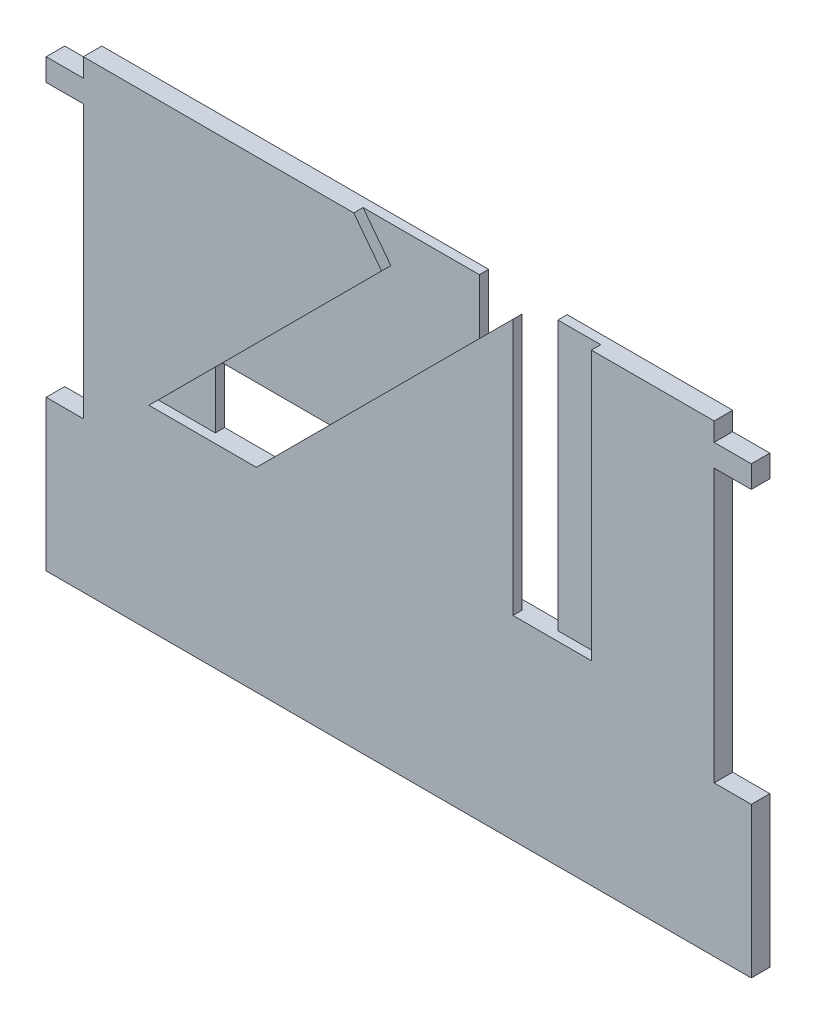
ISO-10303-21;
HEADER;
FILE_DESCRIPTION(('STEP AP214'),'2;1');
FILE_NAME('part.step','',(''),(''),'','','');
FILE_SCHEMA(('AUTOMOTIVE_DESIGN { 1 0 10303 214 1 1 1 1 }'));
ENDSEC;
DATA;
#1=APPLICATION_CONTEXT('core data for automotive mechanical design processes');
#2=APPLICATION_PROTOCOL_DEFINITION('international standard','automotive_design',2000,#1);
#3=PRODUCT_CONTEXT('',#1,'mechanical');
#4=PRODUCT('Part','Part','',(#3));
#5=PRODUCT_RELATED_PRODUCT_CATEGORY('part','',(#4));
#6=PRODUCT_DEFINITION_FORMATION('','',#4);
#7=PRODUCT_DEFINITION_CONTEXT('part definition',#1,'design');
#8=PRODUCT_DEFINITION('design','',#6,#7);
#9=PRODUCT_DEFINITION_SHAPE('','',#8);
#10=(LENGTH_UNIT() NAMED_UNIT(*) SI_UNIT(.MILLI.,.METRE.));
#11=(NAMED_UNIT(*) PLANE_ANGLE_UNIT() SI_UNIT($,.RADIAN.));
#12=(NAMED_UNIT(*) SI_UNIT($,.STERADIAN.) SOLID_ANGLE_UNIT());
#13=UNCERTAINTY_MEASURE_WITH_UNIT(LENGTH_MEASURE(1.E-05),#10,'distance_accuracy_value','');
#14=(GEOMETRIC_REPRESENTATION_CONTEXT(3) GLOBAL_UNCERTAINTY_ASSIGNED_CONTEXT((#13)) GLOBAL_UNIT_ASSIGNED_CONTEXT((#10,
#11,#12)) REPRESENTATION_CONTEXT('',''));
#15=CARTESIAN_POINT('',(0.,0.,0.));
#16=DIRECTION('',(0.,0.,1.));
#17=DIRECTION('',(1.,0.,0.));
#18=AXIS2_PLACEMENT_3D('',#15,#16,#17);
#19=CARTESIAN_POINT('',(-17.,-0.5,1.));
#20=DIRECTION('',(0.,-1.,0.));
#21=DIRECTION('',(0.,0.,-1.));
#22=AXIS2_PLACEMENT_3D('',#19,#20,#21);
#23=PLANE('',#22);
#24=DIRECTION('',(0.,0.,1.));
#25=VECTOR('',#24,1.);
#26=CARTESIAN_POINT('',(-2.42175340145162,-0.5,1.));
#27=LINE('',#26,#25);
#28=CARTESIAN_POINT('',(-2.42175340145161,-0.5,0.5));
#29=VERTEX_POINT('',#28);
#30=CARTESIAN_POINT('',(-2.42175340145161,-0.5,1.));
#31=VERTEX_POINT('',#30);
#32=EDGE_CURVE('E11',#29,#31,#27,.T.);
#33=ORIENTED_EDGE('',*,*,#32,.F.);
#34=DIRECTION('',(1.,0.,0.));
#35=VECTOR('',#34,1.);
#36=CARTESIAN_POINT('',(-17.,-0.5,0.5));
#37=LINE('',#36,#35);
#38=CARTESIAN_POINT('',(3.84615384615386,-0.5,0.5));
#39=VERTEX_POINT('',#38);
#40=EDGE_CURVE('E318',#29,#39,#37,.T.);
#41=ORIENTED_EDGE('',*,*,#40,.T.);
#42=DIRECTION('',(0.,0.,1.));
#43=VECTOR('',#42,1.);
#44=CARTESIAN_POINT('',(3.84615384615386,-0.5,1.));
#45=LINE('',#44,#43);
#46=CARTESIAN_POINT('',(3.84615384615386,-0.5,0.));
#47=VERTEX_POINT('',#46);
#48=EDGE_CURVE('E443',#47,#39,#45,.T.);
#49=ORIENTED_EDGE('',*,*,#48,.F.);
#50=DIRECTION('',(1.,0.,0.));
#51=VECTOR('',#50,1.);
#52=CARTESIAN_POINT('',(-17.,-0.5,0.));
#53=LINE('',#52,#51);
#54=CARTESIAN_POINT('',(-17.,-0.5,0.));
#55=VERTEX_POINT('',#54);
#56=EDGE_CURVE('E449',#47,#55,#53,.F.);
#57=ORIENTED_EDGE('',*,*,#56,.T.);
#58=DIRECTION('',(0.,0.,-1.));
#59=VECTOR('',#58,1.);
#60=CARTESIAN_POINT('',(-17.,-0.5,1.));
#61=LINE('',#60,#59);
#62=CARTESIAN_POINT('',(-17.,-0.5,1.));
#63=VERTEX_POINT('',#62);
#64=EDGE_CURVE('E352',#63,#55,#61,.T.);
#65=ORIENTED_EDGE('',*,*,#64,.F.);
#66=DIRECTION('',(-1.,0.,0.));
#67=VECTOR('',#66,1.);
#68=CARTESIAN_POINT('',(-17.,-0.5,1.));
#69=LINE('',#68,#67);
#70=EDGE_CURVE('E389',#31,#63,#69,.T.);
#71=ORIENTED_EDGE('',*,*,#70,.F.);
#72=EDGE_LOOP('',(#33,#41,#49,#57,#65,#71));
#73=FACE_BOUND('',#72,.T.);
#74=ADVANCED_FACE('F39',(#73),#23,.F.);
#75=DIRECTION('',(0.,0.,-1.));
#76=VECTOR('',#75,1.);
#77=CARTESIAN_POINT('',(10.3846153846144,-0.5,1.));
#78=LINE('',#77,#76);
#79=CARTESIAN_POINT('',(10.3846153846144,-0.5,1.));
#80=VERTEX_POINT('',#79);
#81=CARTESIAN_POINT('',(10.3846153846144,-0.5,0.5));
#82=VERTEX_POINT('',#81);
#83=EDGE_CURVE('E50',#80,#82,#78,.T.);
#84=ORIENTED_EDGE('',*,*,#83,.F.);
#85=CARTESIAN_POINT('',(17.,-0.5,1.));
#86=VERTEX_POINT('',#85);
#87=EDGE_CURVE('E390',#86,#80,#69,.T.);
#88=ORIENTED_EDGE('',*,*,#87,.F.);
#89=DIRECTION('',(0.,0.,-1.));
#90=VECTOR('',#89,1.);
#91=CARTESIAN_POINT('',(17.,-0.5,1.));
#92=LINE('',#91,#90);
#93=CARTESIAN_POINT('',(17.,-0.5,0.));
#94=VERTEX_POINT('',#93);
#95=EDGE_CURVE('E357',#86,#94,#92,.T.);
#96=ORIENTED_EDGE('',*,*,#95,.T.);
#97=DIRECTION('',(1.,0.,0.));
#98=VECTOR('',#97,1.);
#99=CARTESIAN_POINT('',(-17.,-0.5,0.));
#100=LINE('',#99,#98);
#101=CARTESIAN_POINT('',(8.07692307692309,-0.5,0.));
#102=VERTEX_POINT('',#101);
#103=EDGE_CURVE('E445',#94,#102,#100,.F.);
#104=ORIENTED_EDGE('',*,*,#103,.T.);
#105=DIRECTION('',(0.,0.,-1.));
#106=VECTOR('',#105,1.);
#107=CARTESIAN_POINT('',(8.07692307692309,-0.5,1.));
#108=LINE('',#107,#106);
#109=CARTESIAN_POINT('',(8.07692307692309,-0.5,0.5));
#110=VERTEX_POINT('',#109);
#111=EDGE_CURVE('E294',#110,#102,#108,.T.);
#112=ORIENTED_EDGE('',*,*,#111,.F.);
#113=EDGE_CURVE('E268',#110,#82,#37,.T.);
#114=ORIENTED_EDGE('',*,*,#113,.T.);
#115=EDGE_LOOP('',(#84,#88,#96,#104,#112,#114));
#116=FACE_BOUND('',#115,.T.);
#117=ADVANCED_FACE('F532',(#116),#23,.F.);
#118=CARTESIAN_POINT('',(0.,0.,0.5));
#119=DIRECTION('',(0.,0.,1.));
#120=DIRECTION('',(1.,0.,0.));
#121=AXIS2_PLACEMENT_3D('',#118,#119,#120);
#122=PLANE('',#121);
#123=DIRECTION('',(0.,1.,0.));
#124=VECTOR('',#123,1.);
#125=CARTESIAN_POINT('',(6.15384615384512,-15.,0.5));
#126=LINE('',#125,#124);
#127=CARTESIAN_POINT('',(6.15384615384512,-15.,0.5));
#128=VERTEX_POINT('',#127);
#129=CARTESIAN_POINT('',(6.15384615384512,-1.17788461538462,0.5));
#130=VERTEX_POINT('',#129);
#131=EDGE_CURVE('E272',#128,#130,#126,.T.);
#132=ORIENTED_EDGE('',*,*,#131,.F.);
#133=DIRECTION('',(1.,0.,0.));
#134=VECTOR('',#133,1.);
#135=CARTESIAN_POINT('',(-10.3846153846154,-15.,0.5));
#136=LINE('',#135,#134);
#137=CARTESIAN_POINT('',(-7.66826923077026,-15.,0.5));
#138=VERTEX_POINT('',#137);
#139=EDGE_CURVE('E317',#138,#128,#136,.T.);
#140=ORIENTED_EDGE('',*,*,#139,.F.);
#141=DIRECTION('',(-0.707106781186547,-0.707106781186547,0.));
#142=VECTOR('',#141,1.);
#143=CARTESIAN_POINT('',(6.15384615384512,-1.17788461538462,0.5));
#144=LINE('',#143,#142);
#145=CARTESIAN_POINT('',(-4.2067307692318,-11.5384615384615,0.5));
#146=VERTEX_POINT('',#145);
#147=EDGE_CURVE('E276',#146,#138,#144,.T.);
#148=ORIENTED_EDGE('',*,*,#147,.F.);
#149=DIRECTION('',(-1.,0.,0.));
#150=VECTOR('',#149,1.);
#151=CARTESIAN_POINT('',(3.84615384615386,-11.5384615384615,0.5));
#152=LINE('',#151,#150);
#153=CARTESIAN_POINT('',(3.84615384615386,-11.5384615384615,0.5));
#154=VERTEX_POINT('',#153);
#155=EDGE_CURVE('E326',#154,#146,#152,.T.);
#156=ORIENTED_EDGE('',*,*,#155,.F.);
#157=DIRECTION('',(0.,-1.,0.));
#158=VECTOR('',#157,1.);
#159=CARTESIAN_POINT('',(3.84615384615386,15.,0.5));
#160=LINE('',#159,#158);
#161=CARTESIAN_POINT('',(3.84615384615386,-3.48557692307587,0.5));
#162=VERTEX_POINT('',#161);
#163=EDGE_CURVE('E323',#162,#154,#160,.T.);
#164=ORIENTED_EDGE('',*,*,#163,.F.);
#165=EDGE_CURVE('E278',#130,#162,#144,.T.);
#166=ORIENTED_EDGE('',*,*,#165,.F.);
#167=EDGE_LOOP('',(#132,#140,#148,#156,#164,#166));
#168=FACE_BOUND('',#167,.T.);
#169=ADVANCED_FACE('F601',(#168),#122,.F.);
#170=DIRECTION('',(0.707106781186548,0.707106781186547,0.));
#171=VECTOR('',#170,1.);
#172=CARTESIAN_POINT('',(-13.4615384615395,-15.,0.5));
#173=LINE('',#172,#171);
#174=CARTESIAN_POINT('',(-10.3846153846154,-11.9230769230759,0.5));
#175=VERTEX_POINT('',#174);
#176=CARTESIAN_POINT('',(-10.000000000001,-11.5384615384615,0.5));
#177=VERTEX_POINT('',#176);
#178=EDGE_CURVE('E290',#175,#177,#173,.T.);
#179=ORIENTED_EDGE('',*,*,#178,.F.);
#180=DIRECTION('',(0.,-1.,0.));
#181=VECTOR('',#180,1.);
#182=CARTESIAN_POINT('',(-10.3846153846154,-11.5384615384615,0.5));
#183=LINE('',#182,#181);
#184=CARTESIAN_POINT('',(-10.3846153846154,-11.5384615384615,0.5));
#185=VERTEX_POINT('',#184);
#186=EDGE_CURVE('E331',#185,#175,#183,.T.);
#187=ORIENTED_EDGE('',*,*,#186,.F.);
#188=EDGE_CURVE('E329',#177,#185,#152,.T.);
#189=ORIENTED_EDGE('',*,*,#188,.F.);
#190=EDGE_LOOP('',(#179,#187,#189));
#191=FACE_BOUND('',#190,.T.);
#192=ADVANCED_FACE('F787',(#191),#122,.F.);
#193=CARTESIAN_POINT('',(0.,0.,0.));
#194=DIRECTION('',(0.,0.,-1.));
#195=DIRECTION('',(-1.,0.,0.));
#196=AXIS2_PLACEMENT_3D('',#193,#194,#195);
#197=PLANE('',#196);
#198=ORIENTED_EDGE('',*,*,#56,.F.);
#199=DIRECTION('',(0.,-1.,0.));
#200=VECTOR('',#199,1.);
#201=CARTESIAN_POINT('',(3.84615384615386,15.,0.));
#202=LINE('',#201,#200);
#203=CARTESIAN_POINT('',(3.84615384615386,-11.5384615384615,0.));
#204=VERTEX_POINT('',#203);
#205=EDGE_CURVE('E436',#47,#204,#202,.T.);
#206=ORIENTED_EDGE('',*,*,#205,.T.);
#207=DIRECTION('',(-1.,0.,0.));
#208=VECTOR('',#207,1.);
#209=CARTESIAN_POINT('',(3.84615384615386,-11.5384615384615,0.));
#210=LINE('',#209,#208);
#211=CARTESIAN_POINT('',(-10.3846153846154,-11.5384615384615,0.));
#212=VERTEX_POINT('',#211);
#213=EDGE_CURVE('E344',#204,#212,#210,.T.);
#214=ORIENTED_EDGE('',*,*,#213,.T.);
#215=DIRECTION('',(0.,-1.,0.));
#216=VECTOR('',#215,1.);
#217=CARTESIAN_POINT('',(-10.3846153846154,-11.5384615384615,0.));
#218=LINE('',#217,#216);
#219=CARTESIAN_POINT('',(-10.3846153846154,-15.,0.));
#220=VERTEX_POINT('',#219);
#221=EDGE_CURVE('E325',#212,#220,#218,.T.);
#222=ORIENTED_EDGE('',*,*,#221,.T.);
#223=DIRECTION('',(1.,0.,0.));
#224=VECTOR('',#223,1.);
#225=CARTESIAN_POINT('',(-10.3846153846154,-15.,0.));
#226=LINE('',#225,#224);
#227=CARTESIAN_POINT('',(8.07692307692309,-15.,0.));
#228=VERTEX_POINT('',#227);
#229=EDGE_CURVE('E336',#220,#228,#226,.T.);
#230=ORIENTED_EDGE('',*,*,#229,.T.);
#231=DIRECTION('',(0.,1.,0.));
#232=VECTOR('',#231,1.);
#233=CARTESIAN_POINT('',(8.07692307692309,-15.,0.));
#234=LINE('',#233,#232);
#235=EDGE_CURVE('E342',#228,#102,#234,.T.);
#236=ORIENTED_EDGE('',*,*,#235,.T.);
#237=ORIENTED_EDGE('',*,*,#103,.F.);
#238=DIRECTION('',(0.,1.,0.));
#239=VECTOR('',#238,1.);
#240=CARTESIAN_POINT('',(17.,-0.5,0.));
#241=LINE('',#240,#239);
#242=CARTESIAN_POINT('',(17.,-1.5,0.));
#243=VERTEX_POINT('',#242);
#244=EDGE_CURVE('E393',#243,#94,#241,.T.);
#245=ORIENTED_EDGE('',*,*,#244,.F.);
#246=DIRECTION('',(1.,0.,0.));
#247=VECTOR('',#246,1.);
#248=CARTESIAN_POINT('',(17.,-1.5,0.));
#249=LINE('',#248,#247);
#250=CARTESIAN_POINT('',(19.,-1.5,0.));
#251=VERTEX_POINT('',#250);
#252=EDGE_CURVE('E452',#251,#243,#249,.F.);
#253=ORIENTED_EDGE('',*,*,#252,.F.);
#254=DIRECTION('',(0.,1.,0.));
#255=VECTOR('',#254,1.);
#256=CARTESIAN_POINT('',(19.,-1.5,0.));
#257=LINE('',#256,#255);
#258=CARTESIAN_POINT('',(19.,-2.7,0.));
#259=VERTEX_POINT('',#258);
#260=EDGE_CURVE('E456',#259,#251,#257,.T.);
#261=ORIENTED_EDGE('',*,*,#260,.F.);
#262=DIRECTION('',(1.,0.,0.));
#263=VECTOR('',#262,1.);
#264=CARTESIAN_POINT('',(19.,-2.7,0.));
#265=LINE('',#264,#263);
#266=CARTESIAN_POINT('',(17.,-2.7,0.));
#267=VERTEX_POINT('',#266);
#268=EDGE_CURVE('E457',#267,#259,#265,.T.);
#269=ORIENTED_EDGE('',*,*,#268,.F.);
#270=DIRECTION('',(0.,1.,0.));
#271=VECTOR('',#270,1.);
#272=CARTESIAN_POINT('',(17.,-2.7,0.));
#273=LINE('',#272,#271);
#274=CARTESIAN_POINT('',(17.,-17.3947217067352,0.));
#275=VERTEX_POINT('',#274);
#276=EDGE_CURVE('E459',#275,#267,#273,.T.);
#277=ORIENTED_EDGE('',*,*,#276,.F.);
#278=DIRECTION('',(1.,0.,0.));
#279=VECTOR('',#278,1.);
#280=CARTESIAN_POINT('',(17.,-17.3947217067352,0.));
#281=LINE('',#280,#279);
#282=CARTESIAN_POINT('',(19.,-17.3947217067352,0.));
#283=VERTEX_POINT('',#282);
#284=EDGE_CURVE('E465',#283,#275,#281,.F.);
#285=ORIENTED_EDGE('',*,*,#284,.F.);
#286=DIRECTION('',(0.,1.,0.));
#287=VECTOR('',#286,1.);
#288=CARTESIAN_POINT('',(19.,-17.3947217067352,0.));
#289=LINE('',#288,#287);
#290=CARTESIAN_POINT('',(19.,-25.5,0.));
#291=VERTEX_POINT('',#290);
#292=EDGE_CURVE('E461',#291,#283,#289,.T.);
#293=ORIENTED_EDGE('',*,*,#292,.F.);
#294=DIRECTION('',(1.,0.,0.));
#295=VECTOR('',#294,1.);
#296=CARTESIAN_POINT('',(19.,-25.5,0.));
#297=LINE('',#296,#295);
#298=CARTESIAN_POINT('',(-19.,-25.5,0.));
#299=VERTEX_POINT('',#298);
#300=EDGE_CURVE('E467',#299,#291,#297,.T.);
#301=ORIENTED_EDGE('',*,*,#300,.F.);
#302=DIRECTION('',(0.,1.,0.));
#303=VECTOR('',#302,1.);
#304=CARTESIAN_POINT('',(-19.,-25.5,0.));
#305=LINE('',#304,#303);
#306=CARTESIAN_POINT('',(-19.,-17.3947217067352,0.));
#307=VERTEX_POINT('',#306);
#308=EDGE_CURVE('E470',#307,#299,#305,.F.);
#309=ORIENTED_EDGE('',*,*,#308,.F.);
#310=DIRECTION('',(1.,0.,0.));
#311=VECTOR('',#310,1.);
#312=CARTESIAN_POINT('',(-19.,-17.3947217067352,0.));
#313=LINE('',#312,#311);
#314=CARTESIAN_POINT('',(-17.,-17.3947217067352,0.));
#315=VERTEX_POINT('',#314);
#316=EDGE_CURVE('E468',#315,#307,#313,.F.);
#317=ORIENTED_EDGE('',*,*,#316,.F.);
#318=DIRECTION('',(0.,1.,0.));
#319=VECTOR('',#318,1.);
#320=CARTESIAN_POINT('',(-17.,-17.3947217067352,0.));
#321=LINE('',#320,#319);
#322=CARTESIAN_POINT('',(-17.,-2.7,0.));
#323=VERTEX_POINT('',#322);
#324=EDGE_CURVE('E475',#323,#315,#321,.F.);
#325=ORIENTED_EDGE('',*,*,#324,.F.);
#326=DIRECTION('',(1.,0.,0.));
#327=VECTOR('',#326,1.);
#328=CARTESIAN_POINT('',(-17.,-2.7,0.));
#329=LINE('',#328,#327);
#330=CARTESIAN_POINT('',(-19.,-2.7,0.));
#331=VERTEX_POINT('',#330);
#332=EDGE_CURVE('E474',#331,#323,#329,.T.);
#333=ORIENTED_EDGE('',*,*,#332,.F.);
#334=DIRECTION('',(0.,1.,0.));
#335=VECTOR('',#334,1.);
#336=CARTESIAN_POINT('',(-19.,-2.7,0.));
#337=LINE('',#336,#335);
#338=CARTESIAN_POINT('',(-19.,-1.5,0.));
#339=VERTEX_POINT('',#338);
#340=EDGE_CURVE('E477',#339,#331,#337,.F.);
#341=ORIENTED_EDGE('',*,*,#340,.F.);
#342=DIRECTION('',(1.,0.,0.));
#343=VECTOR('',#342,1.);
#344=CARTESIAN_POINT('',(-19.,-1.5,0.));
#345=LINE('',#344,#343);
#346=CARTESIAN_POINT('',(-17.,-1.5,0.));
#347=VERTEX_POINT('',#346);
#348=EDGE_CURVE('E480',#347,#339,#345,.F.);
#349=ORIENTED_EDGE('',*,*,#348,.F.);
#350=DIRECTION('',(0.,1.,0.));
#351=VECTOR('',#350,1.);
#352=CARTESIAN_POINT('',(-17.,-1.5,0.));
#353=LINE('',#352,#351);
#354=EDGE_CURVE('E455',#55,#347,#353,.F.);
#355=ORIENTED_EDGE('',*,*,#354,.F.);
#356=EDGE_LOOP('',(#198,#206,#214,#222,#230,#236,#237,#245,#253,#261,#269,#277,#285,#293,#301,
#309,#317,#325,#333,#341,#349,#355));
#357=FACE_BOUND('',#356,.T.);
#358=ADVANCED_FACE('F492',(#357),#197,.T.);
#359=CARTESIAN_POINT('',(-17.,-1.5,1.));
#360=DIRECTION('',(1.,0.,0.));
#361=DIRECTION('',(0.,0.,-1.));
#362=AXIS2_PLACEMENT_3D('',#359,#360,#361);
#363=PLANE('',#362);
#364=ORIENTED_EDGE('',*,*,#354,.T.);
#365=DIRECTION('',(0.,0.,-1.));
#366=VECTOR('',#365,1.);
#367=CARTESIAN_POINT('',(-17.,-1.5,1.));
#368=LINE('',#367,#366);
#369=CARTESIAN_POINT('',(-17.,-1.5,1.));
#370=VERTEX_POINT('',#369);
#371=EDGE_CURVE('E395',#370,#347,#368,.T.);
#372=ORIENTED_EDGE('',*,*,#371,.F.);
#373=DIRECTION('',(0.,-1.,0.));
#374=VECTOR('',#373,1.);
#375=CARTESIAN_POINT('',(-17.,-1.5,1.));
#376=LINE('',#375,#374);
#377=EDGE_CURVE('E383',#63,#370,#376,.T.);
#378=ORIENTED_EDGE('',*,*,#377,.F.);
#379=ORIENTED_EDGE('',*,*,#64,.T.);
#380=EDGE_LOOP('',(#364,#372,#378,#379));
#381=FACE_BOUND('',#380,.T.);
#382=ADVANCED_FACE('F481',(#381),#363,.F.);
#383=CARTESIAN_POINT('',(-19.,-1.5,1.));
#384=DIRECTION('',(0.,-1.,0.));
#385=DIRECTION('',(1.,0.,0.));
#386=AXIS2_PLACEMENT_3D('',#383,#384,#385);
#387=PLANE('',#386);
#388=ORIENTED_EDGE('',*,*,#348,.T.);
#389=DIRECTION('',(0.,0.,-1.));
#390=VECTOR('',#389,1.);
#391=CARTESIAN_POINT('',(-19.,-1.5,1.));
#392=LINE('',#391,#390);
#393=CARTESIAN_POINT('',(-19.,-1.5,1.));
#394=VERTEX_POINT('',#393);
#395=EDGE_CURVE('E400',#394,#339,#392,.T.);
#396=ORIENTED_EDGE('',*,*,#395,.F.);
#397=DIRECTION('',(-1.,0.,0.));
#398=VECTOR('',#397,1.);
#399=CARTESIAN_POINT('',(-19.,-1.5,1.));
#400=LINE('',#399,#398);
#401=EDGE_CURVE('E381',#370,#394,#400,.T.);
#402=ORIENTED_EDGE('',*,*,#401,.F.);
#403=ORIENTED_EDGE('',*,*,#371,.T.);
#404=EDGE_LOOP('',(#388,#396,#402,#403));
#405=FACE_BOUND('',#404,.T.);
#406=ADVANCED_FACE('F491',(#405),#387,.F.);
#407=CARTESIAN_POINT('',(-19.,-2.7,1.));
#408=DIRECTION('',(1.,0.,0.));
#409=DIRECTION('',(0.,0.,-1.));
#410=AXIS2_PLACEMENT_3D('',#407,#408,#409);
#411=PLANE('',#410);
#412=ORIENTED_EDGE('',*,*,#340,.T.);
#413=DIRECTION('',(0.,0.,-1.));
#414=VECTOR('',#413,1.);
#415=CARTESIAN_POINT('',(-19.,-2.7,1.));
#416=LINE('',#415,#414);
#417=CARTESIAN_POINT('',(-19.,-2.7,1.));
#418=VERTEX_POINT('',#417);
#419=EDGE_CURVE('E397',#418,#331,#416,.T.);
#420=ORIENTED_EDGE('',*,*,#419,.F.);
#421=DIRECTION('',(0.,-1.,0.));
#422=VECTOR('',#421,1.);
#423=CARTESIAN_POINT('',(-19.,-2.7,1.));
#424=LINE('',#423,#422);
#425=EDGE_CURVE('E382',#394,#418,#424,.T.);
#426=ORIENTED_EDGE('',*,*,#425,.F.);
#427=ORIENTED_EDGE('',*,*,#395,.T.);
#428=EDGE_LOOP('',(#412,#420,#426,#427));
#429=FACE_BOUND('',#428,.T.);
#430=ADVANCED_FACE('F497',(#429),#411,.F.);
#431=CARTESIAN_POINT('',(-17.,-2.7,1.));
#432=DIRECTION('',(0.,1.,0.));
#433=DIRECTION('',(0.,0.,1.));
#434=AXIS2_PLACEMENT_3D('',#431,#432,#433);
#435=PLANE('',#434);
#436=ORIENTED_EDGE('',*,*,#332,.T.);
#437=DIRECTION('',(0.,0.,-1.));
#438=VECTOR('',#437,1.);
#439=CARTESIAN_POINT('',(-17.,-2.7,1.));
#440=LINE('',#439,#438);
#441=CARTESIAN_POINT('',(-17.,-2.7,1.));
#442=VERTEX_POINT('',#441);
#443=EDGE_CURVE('E403',#442,#323,#440,.T.);
#444=ORIENTED_EDGE('',*,*,#443,.F.);
#445=DIRECTION('',(1.,0.,0.));
#446=VECTOR('',#445,1.);
#447=CARTESIAN_POINT('',(-17.,-2.7,1.));
#448=LINE('',#447,#446);
#449=EDGE_CURVE('E376',#418,#442,#448,.T.);
#450=ORIENTED_EDGE('',*,*,#449,.F.);
#451=ORIENTED_EDGE('',*,*,#419,.T.);
#452=EDGE_LOOP('',(#436,#444,#450,#451));
#453=FACE_BOUND('',#452,.T.);
#454=ADVANCED_FACE('F502',(#453),#435,.F.);
#455=CARTESIAN_POINT('',(-17.,-17.3947217067352,1.));
#456=DIRECTION('',(1.,0.,0.));
#457=DIRECTION('',(0.,0.,-1.));
#458=AXIS2_PLACEMENT_3D('',#455,#456,#457);
#459=PLANE('',#458);
#460=ORIENTED_EDGE('',*,*,#324,.T.);
#461=DIRECTION('',(0.,0.,-1.));
#462=VECTOR('',#461,1.);
#463=CARTESIAN_POINT('',(-17.,-17.3947217067352,1.));
#464=LINE('',#463,#462);
#465=CARTESIAN_POINT('',(-17.,-17.3947217067352,1.));
#466=VERTEX_POINT('',#465);
#467=EDGE_CURVE('E406',#466,#315,#464,.T.);
#468=ORIENTED_EDGE('',*,*,#467,.F.);
#469=DIRECTION('',(0.,-1.,0.));
#470=VECTOR('',#469,1.);
#471=CARTESIAN_POINT('',(-17.,-17.3947217067352,1.));
#472=LINE('',#471,#470);
#473=EDGE_CURVE('E379',#442,#466,#472,.T.);
#474=ORIENTED_EDGE('',*,*,#473,.F.);
#475=ORIENTED_EDGE('',*,*,#443,.T.);
#476=EDGE_LOOP('',(#460,#468,#474,#475));
#477=FACE_BOUND('',#476,.T.);
#478=ADVANCED_FACE('F588',(#477),#459,.F.);
#479=CARTESIAN_POINT('',(-19.,-17.3947217067352,1.));
#480=DIRECTION('',(0.,-1.,0.));
#481=DIRECTION('',(0.,0.,-1.));
#482=AXIS2_PLACEMENT_3D('',#479,#480,#481);
#483=PLANE('',#482);
#484=ORIENTED_EDGE('',*,*,#316,.T.);
#485=DIRECTION('',(0.,0.,-1.));
#486=VECTOR('',#485,1.);
#487=CARTESIAN_POINT('',(-19.,-17.3947217067352,1.));
#488=LINE('',#487,#486);
#489=CARTESIAN_POINT('',(-19.,-17.3947217067352,1.));
#490=VERTEX_POINT('',#489);
#491=EDGE_CURVE('E407',#490,#307,#488,.T.);
#492=ORIENTED_EDGE('',*,*,#491,.F.);
#493=DIRECTION('',(-1.,0.,0.));
#494=VECTOR('',#493,1.);
#495=CARTESIAN_POINT('',(-19.,-17.3947217067352,1.));
#496=LINE('',#495,#494);
#497=EDGE_CURVE('E373',#466,#490,#496,.T.);
#498=ORIENTED_EDGE('',*,*,#497,.F.);
#499=ORIENTED_EDGE('',*,*,#467,.T.);
#500=EDGE_LOOP('',(#484,#492,#498,#499));
#501=FACE_BOUND('',#500,.T.);
#502=ADVANCED_FACE('F584',(#501),#483,.F.);
#503=CARTESIAN_POINT('',(-19.,-25.5,1.));
#504=DIRECTION('',(1.,0.,0.));
#505=DIRECTION('',(0.,0.,-1.));
#506=AXIS2_PLACEMENT_3D('',#503,#504,#505);
#507=PLANE('',#506);
#508=ORIENTED_EDGE('',*,*,#308,.T.);
#509=DIRECTION('',(0.,0.,-1.));
#510=VECTOR('',#509,1.);
#511=CARTESIAN_POINT('',(-19.,-25.5,1.));
#512=LINE('',#511,#510);
#513=CARTESIAN_POINT('',(-19.,-25.5,1.));
#514=VERTEX_POINT('',#513);
#515=EDGE_CURVE('E415',#514,#299,#512,.T.);
#516=ORIENTED_EDGE('',*,*,#515,.F.);
#517=DIRECTION('',(0.,-1.,0.));
#518=VECTOR('',#517,1.);
#519=CARTESIAN_POINT('',(-19.,-25.5,1.));
#520=LINE('',#519,#518);
#521=EDGE_CURVE('E374',#490,#514,#520,.T.);
#522=ORIENTED_EDGE('',*,*,#521,.F.);
#523=ORIENTED_EDGE('',*,*,#491,.T.);
#524=EDGE_LOOP('',(#508,#516,#522,#523));
#525=FACE_BOUND('',#524,.T.);
#526=ADVANCED_FACE('F581',(#525),#507,.F.);
#527=CARTESIAN_POINT('',(19.,-25.5,1.));
#528=DIRECTION('',(0.,1.,0.));
#529=DIRECTION('',(0.,0.,1.));
#530=AXIS2_PLACEMENT_3D('',#527,#528,#529);
#531=PLANE('',#530);
#532=ORIENTED_EDGE('',*,*,#300,.T.);
#533=DIRECTION('',(0.,0.,-1.));
#534=VECTOR('',#533,1.);
#535=CARTESIAN_POINT('',(19.,-25.5,1.));
#536=LINE('',#535,#534);
#537=CARTESIAN_POINT('',(19.,-25.5,1.));
#538=VERTEX_POINT('',#537);
#539=EDGE_CURVE('E414',#538,#291,#536,.T.);
#540=ORIENTED_EDGE('',*,*,#539,.F.);
#541=DIRECTION('',(1.,0.,0.));
#542=VECTOR('',#541,1.);
#543=CARTESIAN_POINT('',(19.,-25.5,1.));
#544=LINE('',#543,#542);
#545=EDGE_CURVE('E372',#514,#538,#544,.T.);
#546=ORIENTED_EDGE('',*,*,#545,.F.);
#547=ORIENTED_EDGE('',*,*,#515,.T.);
#548=EDGE_LOOP('',(#532,#540,#546,#547));
#549=FACE_BOUND('',#548,.T.);
#550=ADVANCED_FACE('F580',(#549),#531,.F.);
#551=CARTESIAN_POINT('',(19.,-17.3947217067352,1.));
#552=DIRECTION('',(-1.,0.,0.));
#553=DIRECTION('',(0.,0.,1.));
#554=AXIS2_PLACEMENT_3D('',#551,#552,#553);
#555=PLANE('',#554);
#556=ORIENTED_EDGE('',*,*,#292,.T.);
#557=DIRECTION('',(0.,0.,-1.));
#558=VECTOR('',#557,1.);
#559=CARTESIAN_POINT('',(19.,-17.3947217067352,1.));
#560=LINE('',#559,#558);
#561=CARTESIAN_POINT('',(19.,-17.3947217067352,1.));
#562=VERTEX_POINT('',#561);
#563=EDGE_CURVE('E419',#562,#283,#560,.T.);
#564=ORIENTED_EDGE('',*,*,#563,.F.);
#565=DIRECTION('',(0.,1.,0.));
#566=VECTOR('',#565,1.);
#567=CARTESIAN_POINT('',(19.,-17.3947217067352,1.));
#568=LINE('',#567,#566);
#569=EDGE_CURVE('E368',#538,#562,#568,.T.);
#570=ORIENTED_EDGE('',*,*,#569,.F.);
#571=ORIENTED_EDGE('',*,*,#539,.T.);
#572=EDGE_LOOP('',(#556,#564,#570,#571));
#573=FACE_BOUND('',#572,.T.);
#574=ADVANCED_FACE('F572',(#573),#555,.F.);
#575=CARTESIAN_POINT('',(17.,-17.3947217067352,1.));
#576=DIRECTION('',(0.,-1.,0.));
#577=DIRECTION('',(0.,0.,-1.));
#578=AXIS2_PLACEMENT_3D('',#575,#576,#577);
#579=PLANE('',#578);
#580=ORIENTED_EDGE('',*,*,#284,.T.);
#581=DIRECTION('',(0.,0.,-1.));
#582=VECTOR('',#581,1.);
#583=CARTESIAN_POINT('',(17.,-17.3947217067352,1.));
#584=LINE('',#583,#582);
#585=CARTESIAN_POINT('',(17.,-17.3947217067352,1.));
#586=VERTEX_POINT('',#585);
#587=EDGE_CURVE('E422',#586,#275,#584,.T.);
#588=ORIENTED_EDGE('',*,*,#587,.F.);
#589=DIRECTION('',(-1.,0.,0.));
#590=VECTOR('',#589,1.);
#591=CARTESIAN_POINT('',(17.,-17.3947217067352,1.));
#592=LINE('',#591,#590);
#593=EDGE_CURVE('E370',#562,#586,#592,.T.);
#594=ORIENTED_EDGE('',*,*,#593,.F.);
#595=ORIENTED_EDGE('',*,*,#563,.T.);
#596=EDGE_LOOP('',(#580,#588,#594,#595));
#597=FACE_BOUND('',#596,.T.);
#598=ADVANCED_FACE('F567',(#597),#579,.F.);
#599=CARTESIAN_POINT('',(17.,-2.7,1.));
#600=DIRECTION('',(-1.,0.,0.));
#601=DIRECTION('',(0.,0.,1.));
#602=AXIS2_PLACEMENT_3D('',#599,#600,#601);
#603=PLANE('',#602);
#604=ORIENTED_EDGE('',*,*,#276,.T.);
#605=DIRECTION('',(0.,0.,-1.));
#606=VECTOR('',#605,1.);
#607=CARTESIAN_POINT('',(17.,-2.7,1.));
#608=LINE('',#607,#606);
#609=CARTESIAN_POINT('',(17.,-2.7,1.));
#610=VERTEX_POINT('',#609);
#611=EDGE_CURVE('E421',#610,#267,#608,.T.);
#612=ORIENTED_EDGE('',*,*,#611,.F.);
#613=DIRECTION('',(0.,1.,0.));
#614=VECTOR('',#613,1.);
#615=CARTESIAN_POINT('',(17.,-2.7,1.));
#616=LINE('',#615,#614);
#617=EDGE_CURVE('E364',#586,#610,#616,.T.);
#618=ORIENTED_EDGE('',*,*,#617,.F.);
#619=ORIENTED_EDGE('',*,*,#587,.T.);
#620=EDGE_LOOP('',(#604,#612,#618,#619));
#621=FACE_BOUND('',#620,.T.);
#622=ADVANCED_FACE('F565',(#621),#603,.F.);
#623=CARTESIAN_POINT('',(19.,-2.7,1.));
#624=DIRECTION('',(0.,1.,0.));
#625=DIRECTION('',(0.,0.,1.));
#626=AXIS2_PLACEMENT_3D('',#623,#624,#625);
#627=PLANE('',#626);
#628=ORIENTED_EDGE('',*,*,#268,.T.);
#629=DIRECTION('',(0.,0.,-1.));
#630=VECTOR('',#629,1.);
#631=CARTESIAN_POINT('',(19.,-2.7,1.));
#632=LINE('',#631,#630);
#633=CARTESIAN_POINT('',(19.,-2.7,1.));
#634=VERTEX_POINT('',#633);
#635=EDGE_CURVE('E430',#634,#259,#632,.T.);
#636=ORIENTED_EDGE('',*,*,#635,.F.);
#637=DIRECTION('',(1.,0.,0.));
#638=VECTOR('',#637,1.);
#639=CARTESIAN_POINT('',(19.,-2.7,1.));
#640=LINE('',#639,#638);
#641=EDGE_CURVE('E363',#610,#634,#640,.T.);
#642=ORIENTED_EDGE('',*,*,#641,.F.);
#643=ORIENTED_EDGE('',*,*,#611,.T.);
#644=EDGE_LOOP('',(#628,#636,#642,#643));
#645=FACE_BOUND('',#644,.T.);
#646=ADVANCED_FACE('F559',(#645),#627,.F.);
#647=CARTESIAN_POINT('',(19.,-1.5,1.));
#648=DIRECTION('',(-1.,0.,0.));
#649=DIRECTION('',(0.,0.,1.));
#650=AXIS2_PLACEMENT_3D('',#647,#648,#649);
#651=PLANE('',#650);
#652=ORIENTED_EDGE('',*,*,#260,.T.);
#653=DIRECTION('',(0.,0.,-1.));
#654=VECTOR('',#653,1.);
#655=CARTESIAN_POINT('',(19.,-1.5,1.));
#656=LINE('',#655,#654);
#657=CARTESIAN_POINT('',(19.,-1.5,1.));
#658=VERTEX_POINT('',#657);
#659=EDGE_CURVE('E428',#658,#251,#656,.T.);
#660=ORIENTED_EDGE('',*,*,#659,.F.);
#661=DIRECTION('',(0.,1.,0.));
#662=VECTOR('',#661,1.);
#663=CARTESIAN_POINT('',(19.,-1.5,1.));
#664=LINE('',#663,#662);
#665=EDGE_CURVE('E361',#634,#658,#664,.T.);
#666=ORIENTED_EDGE('',*,*,#665,.F.);
#667=ORIENTED_EDGE('',*,*,#635,.T.);
#668=EDGE_LOOP('',(#652,#660,#666,#667));
#669=FACE_BOUND('',#668,.T.);
#670=ADVANCED_FACE('F552',(#669),#651,.F.);
#671=CARTESIAN_POINT('',(17.,-1.5,1.));
#672=DIRECTION('',(0.,-1.,0.));
#673=DIRECTION('',(1.,0.,0.));
#674=AXIS2_PLACEMENT_3D('',#671,#672,#673);
#675=PLANE('',#674);
#676=ORIENTED_EDGE('',*,*,#252,.T.);
#677=DIRECTION('',(0.,0.,-1.));
#678=VECTOR('',#677,1.);
#679=CARTESIAN_POINT('',(17.,-1.5,1.));
#680=LINE('',#679,#678);
#681=CARTESIAN_POINT('',(17.,-1.5,1.));
#682=VERTEX_POINT('',#681);
#683=EDGE_CURVE('E435',#682,#243,#680,.T.);
#684=ORIENTED_EDGE('',*,*,#683,.F.);
#685=DIRECTION('',(-1.,0.,0.));
#686=VECTOR('',#685,1.);
#687=CARTESIAN_POINT('',(17.,-1.5,1.));
#688=LINE('',#687,#686);
#689=EDGE_CURVE('E358',#658,#682,#688,.T.);
#690=ORIENTED_EDGE('',*,*,#689,.F.);
#691=ORIENTED_EDGE('',*,*,#659,.T.);
#692=EDGE_LOOP('',(#676,#684,#690,#691));
#693=FACE_BOUND('',#692,.T.);
#694=ADVANCED_FACE('F550',(#693),#675,.F.);
#695=CARTESIAN_POINT('',(17.,-0.5,1.));
#696=DIRECTION('',(-1.,0.,0.));
#697=DIRECTION('',(0.,0.,1.));
#698=AXIS2_PLACEMENT_3D('',#695,#696,#697);
#699=PLANE('',#698);
#700=ORIENTED_EDGE('',*,*,#244,.T.);
#701=ORIENTED_EDGE('',*,*,#95,.F.);
#702=DIRECTION('',(0.,1.,0.));
#703=VECTOR('',#702,1.);
#704=CARTESIAN_POINT('',(17.,-0.5,1.));
#705=LINE('',#704,#703);
#706=EDGE_CURVE('E356',#682,#86,#705,.T.);
#707=ORIENTED_EDGE('',*,*,#706,.F.);
#708=ORIENTED_EDGE('',*,*,#683,.T.);
#709=EDGE_LOOP('',(#700,#701,#707,#708));
#710=FACE_BOUND('',#709,.T.);
#711=ADVANCED_FACE('F545',(#710),#699,.F.);
#712=CARTESIAN_POINT('',(0.,0.,1.));
#713=DIRECTION('',(0.,0.,-1.));
#714=DIRECTION('',(-1.,0.,0.));
#715=AXIS2_PLACEMENT_3D('',#712,#713,#714);
#716=PLANE('',#715);
#717=DIRECTION('',(0.707106781186548,0.707106781186547,0.));
#718=VECTOR('',#717,1.);
#719=CARTESIAN_POINT('',(-13.4615384615395,-15.,1.));
#720=LINE('',#719,#718);
#721=CARTESIAN_POINT('',(-13.4615384615395,-15.,1.));
#722=VERTEX_POINT('',#721);
#723=CARTESIAN_POINT('',(-0.925480769231801,-2.46394230769231,1.));
#724=VERTEX_POINT('',#723);
#725=EDGE_CURVE('E304',#722,#724,#720,.T.);
#726=ORIENTED_EDGE('',*,*,#725,.T.);
#727=DIRECTION('',(-0.606026720954855,0.795444286854024,0.));
#728=VECTOR('',#727,1.);
#729=CARTESIAN_POINT('',(-0.925480769231801,-2.46394230769231,1.));
#730=LINE('',#729,#728);
#731=EDGE_CURVE('E52',#724,#31,#730,.T.);
#732=ORIENTED_EDGE('',*,*,#731,.T.);
#733=ORIENTED_EDGE('',*,*,#70,.T.);
#734=ORIENTED_EDGE('',*,*,#377,.T.);
#735=ORIENTED_EDGE('',*,*,#401,.T.);
#736=ORIENTED_EDGE('',*,*,#425,.T.);
#737=ORIENTED_EDGE('',*,*,#449,.T.);
#738=ORIENTED_EDGE('',*,*,#473,.T.);
#739=ORIENTED_EDGE('',*,*,#497,.T.);
#740=ORIENTED_EDGE('',*,*,#521,.T.);
#741=ORIENTED_EDGE('',*,*,#545,.T.);
#742=ORIENTED_EDGE('',*,*,#569,.T.);
#743=ORIENTED_EDGE('',*,*,#593,.T.);
#744=ORIENTED_EDGE('',*,*,#617,.T.);
#745=ORIENTED_EDGE('',*,*,#641,.T.);
#746=ORIENTED_EDGE('',*,*,#665,.T.);
#747=ORIENTED_EDGE('',*,*,#689,.T.);
#748=ORIENTED_EDGE('',*,*,#706,.T.);
#749=ORIENTED_EDGE('',*,*,#87,.T.);
#750=DIRECTION('',(0.,-1.,0.));
#751=VECTOR('',#750,1.);
#752=CARTESIAN_POINT('',(10.3846153846144,15.,1.));
#753=LINE('',#752,#751);
#754=CARTESIAN_POINT('',(10.3846153846144,-15.,1.));
#755=VERTEX_POINT('',#754);
#756=EDGE_CURVE('E295',#80,#755,#753,.T.);
#757=ORIENTED_EDGE('',*,*,#756,.T.);
#758=DIRECTION('',(-1.,0.,0.));
#759=VECTOR('',#758,1.);
#760=CARTESIAN_POINT('',(10.3846153846144,-15.,1.));
#761=LINE('',#760,#759);
#762=CARTESIAN_POINT('',(6.15384615384512,-15.,1.));
#763=VERTEX_POINT('',#762);
#764=EDGE_CURVE('E266',#755,#763,#761,.T.);
#765=ORIENTED_EDGE('',*,*,#764,.T.);
#766=DIRECTION('',(0.,1.,0.));
#767=VECTOR('',#766,1.);
#768=CARTESIAN_POINT('',(6.15384615384512,-15.,1.));
#769=LINE('',#768,#767);
#770=CARTESIAN_POINT('',(6.15384615384512,-1.17788461538462,1.));
#771=VERTEX_POINT('',#770);
#772=EDGE_CURVE('E297',#763,#771,#769,.T.);
#773=ORIENTED_EDGE('',*,*,#772,.T.);
#774=DIRECTION('',(-0.707106781186547,-0.707106781186547,0.));
#775=VECTOR('',#774,1.);
#776=CARTESIAN_POINT('',(6.15384615384512,-1.17788461538462,1.));
#777=LINE('',#776,#775);
#778=CARTESIAN_POINT('',(-7.66826923077026,-15.,1.));
#779=VERTEX_POINT('',#778);
#780=EDGE_CURVE('E296',#771,#779,#777,.T.);
#781=ORIENTED_EDGE('',*,*,#780,.T.);
#782=DIRECTION('',(-1.,0.,0.));
#783=VECTOR('',#782,1.);
#784=CARTESIAN_POINT('',(-7.66826923077026,-15.,1.));
#785=LINE('',#784,#783);
#786=EDGE_CURVE('E302',#779,#722,#785,.T.);
#787=ORIENTED_EDGE('',*,*,#786,.T.);
#788=EDGE_LOOP('',(#726,#732,#733,#734,#735,#736,#737,#738,#739,#740,#741,#742,#743,#744,#745,
#746,#747,#748,#749,#757,#765,#773,#781,#787));
#789=FACE_BOUND('',#788,.T.);
#790=ADVANCED_FACE('F41',(#789),#716,.F.);
#791=CARTESIAN_POINT('',(8.07692307692309,-15.,0.5));
#792=DIRECTION('',(-1.,0.,0.));
#793=DIRECTION('',(0.,0.,1.));
#794=AXIS2_PLACEMENT_3D('',#791,#792,#793);
#795=PLANE('',#794);
#796=ORIENTED_EDGE('',*,*,#111,.T.);
#797=ORIENTED_EDGE('',*,*,#235,.F.);
#798=DIRECTION('',(0.,0.,-1.));
#799=VECTOR('',#798,1.);
#800=CARTESIAN_POINT('',(8.07692307692309,-15.,0.5));
#801=LINE('',#800,#799);
#802=CARTESIAN_POINT('',(8.07692307692309,-15.,0.5));
#803=VERTEX_POINT('',#802);
#804=EDGE_CURVE('E351',#803,#228,#801,.T.);
#805=ORIENTED_EDGE('',*,*,#804,.F.);
#806=DIRECTION('',(0.,1.,0.));
#807=VECTOR('',#806,1.);
#808=CARTESIAN_POINT('',(8.07692307692309,-15.,0.5));
#809=LINE('',#808,#807);
#810=EDGE_CURVE('E273',#803,#110,#809,.T.);
#811=ORIENTED_EDGE('',*,*,#810,.T.);
#812=EDGE_LOOP('',(#796,#797,#805,#811));
#813=FACE_BOUND('',#812,.T.);
#814=ADVANCED_FACE('F535',(#813),#795,.T.);
#815=CARTESIAN_POINT('',(3.84615384615386,15.,0.5));
#816=DIRECTION('',(1.,0.,0.));
#817=DIRECTION('',(0.,0.,-1.));
#818=AXIS2_PLACEMENT_3D('',#815,#816,#817);
#819=PLANE('',#818);
#820=ORIENTED_EDGE('',*,*,#48,.T.);
#821=EDGE_CURVE('E324',#39,#162,#160,.T.);
#822=ORIENTED_EDGE('',*,*,#821,.T.);
#823=ORIENTED_EDGE('',*,*,#163,.T.);
#824=DIRECTION('',(0.,0.,-1.));
#825=VECTOR('',#824,1.);
#826=CARTESIAN_POINT('',(3.84615384615386,-11.5384615384615,0.5));
#827=LINE('',#826,#825);
#828=EDGE_CURVE('E353',#154,#204,#827,.T.);
#829=ORIENTED_EDGE('',*,*,#828,.T.);
#830=ORIENTED_EDGE('',*,*,#205,.F.);
#831=EDGE_LOOP('',(#820,#822,#823,#829,#830));
#832=FACE_BOUND('',#831,.T.);
#833=ADVANCED_FACE('F513',(#832),#819,.T.);
#834=CARTESIAN_POINT('',(-10.3846153846154,-15.,0.5));
#835=DIRECTION('',(0.,1.,0.));
#836=DIRECTION('',(0.,0.,1.));
#837=AXIS2_PLACEMENT_3D('',#834,#835,#836);
#838=PLANE('',#837);
#839=ORIENTED_EDGE('',*,*,#229,.F.);
#840=DIRECTION('',(0.,0.,-1.));
#841=VECTOR('',#840,1.);
#842=CARTESIAN_POINT('',(-10.3846153846154,-15.,0.5));
#843=LINE('',#842,#841);
#844=CARTESIAN_POINT('',(-10.3846153846154,-15.,0.5));
#845=VERTEX_POINT('',#844);
#846=EDGE_CURVE('E340',#845,#220,#843,.T.);
#847=ORIENTED_EDGE('',*,*,#846,.F.);
#848=DIRECTION('',(-1.,0.,0.));
#849=VECTOR('',#848,1.);
#850=CARTESIAN_POINT('',(-7.66826923077026,-15.,0.5));
#851=LINE('',#850,#849);
#852=CARTESIAN_POINT('',(-13.4615384615395,-15.,0.5));
#853=VERTEX_POINT('',#852);
#854=EDGE_CURVE('E285',#845,#853,#851,.T.);
#855=ORIENTED_EDGE('',*,*,#854,.T.);
#856=DIRECTION('',(0.,0.,1.));
#857=VECTOR('',#856,1.);
#858=CARTESIAN_POINT('',(-13.4615384615395,-15.,0.5));
#859=LINE('',#858,#857);
#860=EDGE_CURVE('E307',#853,#722,#859,.T.);
#861=ORIENTED_EDGE('',*,*,#860,.T.);
#862=ORIENTED_EDGE('',*,*,#786,.F.);
#863=DIRECTION('',(0.,0.,1.));
#864=VECTOR('',#863,1.);
#865=CARTESIAN_POINT('',(-7.66826923077026,-15.,0.5));
#866=LINE('',#865,#864);
#867=EDGE_CURVE('E315',#138,#779,#866,.T.);
#868=ORIENTED_EDGE('',*,*,#867,.F.);
#869=ORIENTED_EDGE('',*,*,#139,.T.);
#870=DIRECTION('',(0.,0.,1.));
#871=VECTOR('',#870,1.);
#872=CARTESIAN_POINT('',(6.15384615384512,-15.,0.5));
#873=LINE('',#872,#871);
#874=EDGE_CURVE('E267',#128,#763,#873,.T.);
#875=ORIENTED_EDGE('',*,*,#874,.T.);
#876=ORIENTED_EDGE('',*,*,#764,.F.);
#877=DIRECTION('',(0.,0.,1.));
#878=VECTOR('',#877,1.);
#879=CARTESIAN_POINT('',(10.3846153846144,-15.,0.5));
#880=LINE('',#879,#878);
#881=CARTESIAN_POINT('',(10.3846153846144,-15.,0.5));
#882=VERTEX_POINT('',#881);
#883=EDGE_CURVE('E254',#882,#755,#880,.T.);
#884=ORIENTED_EDGE('',*,*,#883,.F.);
#885=DIRECTION('',(-1.,0.,0.));
#886=VECTOR('',#885,1.);
#887=CARTESIAN_POINT('',(10.3846153846144,-15.,0.5));
#888=LINE('',#887,#886);
#889=EDGE_CURVE('E256',#882,#803,#888,.T.);
#890=ORIENTED_EDGE('',*,*,#889,.T.);
#891=ORIENTED_EDGE('',*,*,#804,.T.);
#892=EDGE_LOOP('',(#839,#847,#855,#861,#862,#868,#869,#875,#876,#884,#890,#891));
#893=FACE_BOUND('',#892,.T.);
#894=ADVANCED_FACE('F265',(#893),#838,.T.);
#895=CARTESIAN_POINT('',(3.84615384615386,-11.5384615384615,0.5));
#896=DIRECTION('',(0.,-1.,0.));
#897=DIRECTION('',(0.,0.,-1.));
#898=AXIS2_PLACEMENT_3D('',#895,#896,#897);
#899=PLANE('',#898);
#900=ORIENTED_EDGE('',*,*,#213,.F.);
#901=ORIENTED_EDGE('',*,*,#828,.F.);
#902=ORIENTED_EDGE('',*,*,#155,.T.);
#903=EDGE_CURVE('E335',#146,#177,#152,.T.);
#904=ORIENTED_EDGE('',*,*,#903,.T.);
#905=ORIENTED_EDGE('',*,*,#188,.T.);
#906=DIRECTION('',(0.,0.,-1.));
#907=VECTOR('',#906,1.);
#908=CARTESIAN_POINT('',(-10.3846153846154,-11.5384615384615,0.5));
#909=LINE('',#908,#907);
#910=EDGE_CURVE('E350',#185,#212,#909,.T.);
#911=ORIENTED_EDGE('',*,*,#910,.T.);
#912=EDGE_LOOP('',(#900,#901,#902,#904,#905,#911));
#913=FACE_BOUND('',#912,.T.);
#914=ADVANCED_FACE('F518',(#913),#899,.T.);
#915=CARTESIAN_POINT('',(-10.3846153846154,-11.5384615384615,0.5));
#916=DIRECTION('',(1.,0.,0.));
#917=DIRECTION('',(0.,0.,-1.));
#918=AXIS2_PLACEMENT_3D('',#915,#916,#917);
#919=PLANE('',#918);
#920=ORIENTED_EDGE('',*,*,#221,.F.);
#921=ORIENTED_EDGE('',*,*,#910,.F.);
#922=ORIENTED_EDGE('',*,*,#186,.T.);
#923=EDGE_CURVE('E334',#175,#845,#183,.T.);
#924=ORIENTED_EDGE('',*,*,#923,.T.);
#925=ORIENTED_EDGE('',*,*,#846,.T.);
#926=EDGE_LOOP('',(#920,#921,#922,#924,#925));
#927=FACE_BOUND('',#926,.T.);
#928=ADVANCED_FACE('F527',(#927),#919,.T.);
#929=CARTESIAN_POINT('',(10.3846153846144,15.,0.5));
#930=DIRECTION('',(-1.,0.,0.));
#931=DIRECTION('',(0.,0.,1.));
#932=AXIS2_PLACEMENT_3D('',#929,#930,#931);
#933=PLANE('',#932);
#934=ORIENTED_EDGE('',*,*,#83,.T.);
#935=DIRECTION('',(0.,-1.,0.));
#936=VECTOR('',#935,1.);
#937=CARTESIAN_POINT('',(10.3846153846144,15.,0.5));
#938=LINE('',#937,#936);
#939=EDGE_CURVE('E249',#82,#882,#938,.T.);
#940=ORIENTED_EDGE('',*,*,#939,.T.);
#941=ORIENTED_EDGE('',*,*,#883,.T.);
#942=ORIENTED_EDGE('',*,*,#756,.F.);
#943=EDGE_LOOP('',(#934,#940,#941,#942));
#944=FACE_BOUND('',#943,.T.);
#945=ADVANCED_FACE('F252',(#944),#933,.T.);
#946=CARTESIAN_POINT('',(-0.925480769231801,-2.46394230769231,0.5));
#947=DIRECTION('',(0.795444286854024,0.606026720954855,0.));
#948=DIRECTION('',(-0.606026720954855,0.795444286854024,0.));
#949=AXIS2_PLACEMENT_3D('',#946,#947,#948);
#950=PLANE('',#949);
#951=ORIENTED_EDGE('',*,*,#32,.T.);
#952=ORIENTED_EDGE('',*,*,#731,.F.);
#953=DIRECTION('',(0.,0.,1.));
#954=VECTOR('',#953,1.);
#955=CARTESIAN_POINT('',(-0.925480769231801,-2.46394230769231,0.5));
#956=LINE('',#955,#954);
#957=CARTESIAN_POINT('',(-0.925480769231801,-2.46394230769231,0.5));
#958=VERTEX_POINT('',#957);
#959=EDGE_CURVE('E292',#958,#724,#956,.T.);
#960=ORIENTED_EDGE('',*,*,#959,.F.);
#961=DIRECTION('',(-0.606026720954855,0.795444286854024,0.));
#962=VECTOR('',#961,1.);
#963=CARTESIAN_POINT('',(-0.925480769231801,-2.46394230769231,0.5));
#964=LINE('',#963,#962);
#965=EDGE_CURVE('E289',#958,#29,#964,.T.);
#966=ORIENTED_EDGE('',*,*,#965,.T.);
#967=EDGE_LOOP('',(#951,#952,#960,#966));
#968=FACE_BOUND('',#967,.T.);
#969=ADVANCED_FACE('F730',(#968),#950,.T.);
#970=CARTESIAN_POINT('',(0.,0.,0.5));
#971=DIRECTION('',(0.,0.,-1.));
#972=DIRECTION('',(-1.,0.,0.));
#973=AXIS2_PLACEMENT_3D('',#970,#971,#972);
#974=PLANE('',#973);
#975=EDGE_CURVE('E62',#853,#175,#173,.T.);
#976=ORIENTED_EDGE('',*,*,#975,.F.);
#977=ORIENTED_EDGE('',*,*,#854,.F.);
#978=ORIENTED_EDGE('',*,*,#923,.F.);
#979=EDGE_LOOP('',(#976,#977,#978));
#980=FACE_BOUND('',#979,.T.);
#981=ADVANCED_FACE('F731',(#980),#974,.F.);
#982=EDGE_CURVE('E284',#162,#146,#144,.T.);
#983=ORIENTED_EDGE('',*,*,#982,.F.);
#984=ORIENTED_EDGE('',*,*,#821,.F.);
#985=ORIENTED_EDGE('',*,*,#40,.F.);
#986=ORIENTED_EDGE('',*,*,#965,.F.);
#987=EDGE_CURVE('E283',#177,#958,#173,.T.);
#988=ORIENTED_EDGE('',*,*,#987,.F.);
#989=ORIENTED_EDGE('',*,*,#903,.F.);
#990=EDGE_LOOP('',(#983,#984,#985,#986,#988,#989));
#991=FACE_BOUND('',#990,.T.);
#992=ADVANCED_FACE('F742',(#991),#974,.F.);
#993=ORIENTED_EDGE('',*,*,#889,.F.);
#994=ORIENTED_EDGE('',*,*,#939,.F.);
#995=ORIENTED_EDGE('',*,*,#113,.F.);
#996=ORIENTED_EDGE('',*,*,#810,.F.);
#997=EDGE_LOOP('',(#993,#994,#995,#996));
#998=FACE_BOUND('',#997,.T.);
#999=ADVANCED_FACE('F271',(#998),#974,.F.);
#1000=CARTESIAN_POINT('',(6.15384615384512,-15.,0.5));
#1001=DIRECTION('',(1.,0.,0.));
#1002=DIRECTION('',(0.,0.,-1.));
#1003=AXIS2_PLACEMENT_3D('',#1000,#1001,#1002);
#1004=PLANE('',#1003);
#1005=ORIENTED_EDGE('',*,*,#772,.F.);
#1006=ORIENTED_EDGE('',*,*,#874,.F.);
#1007=ORIENTED_EDGE('',*,*,#131,.T.);
#1008=DIRECTION('',(0.,0.,1.));
#1009=VECTOR('',#1008,1.);
#1010=CARTESIAN_POINT('',(6.15384615384512,-1.17788461538462,0.5));
#1011=LINE('',#1010,#1009);
#1012=EDGE_CURVE('E312',#130,#771,#1011,.T.);
#1013=ORIENTED_EDGE('',*,*,#1012,.T.);
#1014=EDGE_LOOP('',(#1005,#1006,#1007,#1013));
#1015=FACE_BOUND('',#1014,.T.);
#1016=ADVANCED_FACE('F760',(#1015),#1004,.T.);
#1017=CARTESIAN_POINT('',(6.15384615384512,-1.17788461538462,0.5));
#1018=DIRECTION('',(-0.707106781186547,0.707106781186547,0.));
#1019=DIRECTION('',(-0.707106781186548,-0.707106781186548,0.));
#1020=AXIS2_PLACEMENT_3D('',#1017,#1018,#1019);
#1021=PLANE('',#1020);
#1022=ORIENTED_EDGE('',*,*,#780,.F.);
#1023=ORIENTED_EDGE('',*,*,#1012,.F.);
#1024=ORIENTED_EDGE('',*,*,#165,.T.);
#1025=ORIENTED_EDGE('',*,*,#982,.T.);
#1026=ORIENTED_EDGE('',*,*,#147,.T.);
#1027=ORIENTED_EDGE('',*,*,#867,.T.);
#1028=EDGE_LOOP('',(#1022,#1023,#1024,#1025,#1026,#1027));
#1029=FACE_BOUND('',#1028,.T.);
#1030=ADVANCED_FACE('F762',(#1029),#1021,.T.);
#1031=CARTESIAN_POINT('',(-13.4615384615395,-15.,0.5));
#1032=DIRECTION('',(0.707106781186547,-0.707106781186548,0.));
#1033=DIRECTION('',(0.707106781186548,0.707106781186547,0.));
#1034=AXIS2_PLACEMENT_3D('',#1031,#1032,#1033);
#1035=PLANE('',#1034);
#1036=ORIENTED_EDGE('',*,*,#725,.F.);
#1037=ORIENTED_EDGE('',*,*,#860,.F.);
#1038=ORIENTED_EDGE('',*,*,#975,.T.);
#1039=ORIENTED_EDGE('',*,*,#178,.T.);
#1040=ORIENTED_EDGE('',*,*,#987,.T.);
#1041=ORIENTED_EDGE('',*,*,#959,.T.);
#1042=EDGE_LOOP('',(#1036,#1037,#1038,#1039,#1040,#1041));
#1043=FACE_BOUND('',#1042,.T.);
#1044=ADVANCED_FACE('F775',(#1043),#1035,.T.);
#1045=CLOSED_SHELL('',(#74,#117,#169,#192,#358,#382,#406,#430,#454,#478,#502,#526,#550,#574,
#598,#622,#646,#670,#694,#711,#790,#814,#833,#894,#914,#928,#945,#969,#981,#992,#999,#1016,
#1030,#1044));
#1046=MANIFOLD_SOLID_BREP('B2',#1045);
#1047=ADVANCED_BREP_SHAPE_REPRESENTATION('',(#18,#1046),#14);
#1048=SHAPE_DEFINITION_REPRESENTATION(#9,#1047);
ENDSEC;
END-ISO-10303-21;
